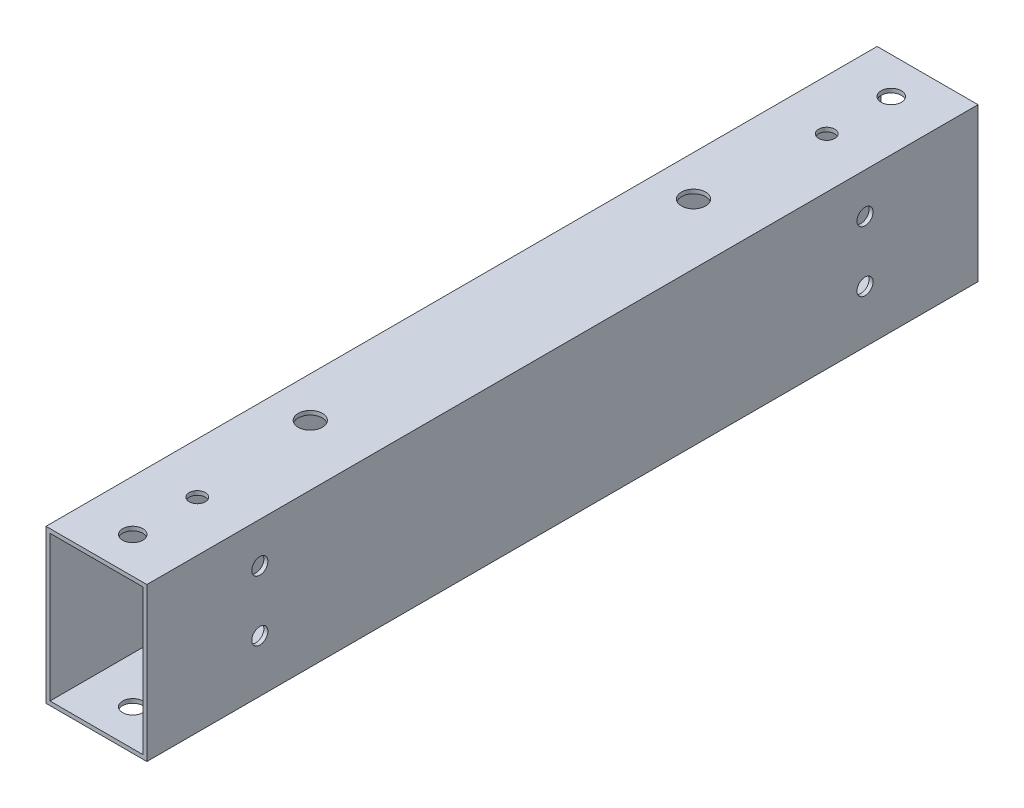
ISO-10303-21;
HEADER;
FILE_DESCRIPTION(('STEP AP214'),'2;1');
FILE_NAME('part.step','',(''),(''),'','','');
FILE_SCHEMA(('AUTOMOTIVE_DESIGN { 1 0 10303 214 1 1 1 1 }'));
ENDSEC;
DATA;
#1=APPLICATION_CONTEXT('core data for automotive mechanical design processes');
#2=APPLICATION_PROTOCOL_DEFINITION('international standard','automotive_design',2000,#1);
#3=PRODUCT_CONTEXT('',#1,'mechanical');
#4=PRODUCT('Part','Part','',(#3));
#5=PRODUCT_RELATED_PRODUCT_CATEGORY('part','',(#4));
#6=PRODUCT_DEFINITION_FORMATION('','',#4);
#7=PRODUCT_DEFINITION_CONTEXT('part definition',#1,'design');
#8=PRODUCT_DEFINITION('design','',#6,#7);
#9=PRODUCT_DEFINITION_SHAPE('','',#8);
#10=(LENGTH_UNIT() NAMED_UNIT(*) SI_UNIT(.MILLI.,.METRE.));
#11=(NAMED_UNIT(*) PLANE_ANGLE_UNIT() SI_UNIT($,.RADIAN.));
#12=(NAMED_UNIT(*) SI_UNIT($,.STERADIAN.) SOLID_ANGLE_UNIT());
#13=UNCERTAINTY_MEASURE_WITH_UNIT(LENGTH_MEASURE(1.E-05),#10,'distance_accuracy_value','');
#14=(GEOMETRIC_REPRESENTATION_CONTEXT(3) GLOBAL_UNCERTAINTY_ASSIGNED_CONTEXT((#13)) GLOBAL_UNIT_ASSIGNED_CONTEXT((#10,
#11,#12)) REPRESENTATION_CONTEXT('',''));
#15=CARTESIAN_POINT('',(0.,0.,0.));
#16=DIRECTION('',(0.,0.,1.));
#17=DIRECTION('',(1.,0.,0.));
#18=AXIS2_PLACEMENT_3D('',#15,#16,#17);
#19=CARTESIAN_POINT('',(-12.5,19.,103.));
#20=DIRECTION('',(0.,-1.,0.));
#21=DIRECTION('',(0.,0.,-1.));
#22=AXIS2_PLACEMENT_3D('',#19,#20,#21);
#23=PLANE('',#22);
#24=CARTESIAN_POINT('',(-2.49999999999999,19.,47.5));
#25=DIRECTION('',(0.,1.,0.));
#26=DIRECTION('',(0.,0.,1.));
#27=AXIS2_PLACEMENT_3D('',#24,#25,#26);
#28=CIRCLE('',#27,3.);
#29=CARTESIAN_POINT('',(-2.49999999999999,19.,50.5));
#30=VERTEX_POINT('',#29);
#31=EDGE_CURVE('E232',#30,#30,#28,.T.);
#32=ORIENTED_EDGE('',*,*,#31,.F.);
#33=EDGE_LOOP('',(#32));
#34=FACE_BOUND('',#33,.T.);
#35=CARTESIAN_POINT('',(-2.5,19.,-47.5));
#36=DIRECTION('',(0.,1.,0.));
#37=DIRECTION('',(0.,0.,1.));
#38=AXIS2_PLACEMENT_3D('',#35,#36,#37);
#39=CIRCLE('',#38,3.);
#40=CARTESIAN_POINT('',(-2.5,19.,-44.5));
#41=VERTEX_POINT('',#40);
#42=EDGE_CURVE('E239',#41,#41,#39,.T.);
#43=ORIENTED_EDGE('',*,*,#42,.F.);
#44=EDGE_LOOP('',(#43));
#45=FACE_BOUND('',#44,.T.);
#46=CARTESIAN_POINT('',(0.,19.,-78.));
#47=DIRECTION('',(0.,1.,0.));
#48=DIRECTION('',(0.,0.,1.));
#49=AXIS2_PLACEMENT_3D('',#46,#47,#48);
#50=CIRCLE('',#49,2.00000000000001);
#51=CARTESIAN_POINT('',(0.,19.,-76.));
#52=VERTEX_POINT('',#51);
#53=EDGE_CURVE('E177',#52,#52,#50,.T.);
#54=ORIENTED_EDGE('',*,*,#53,.F.);
#55=EDGE_LOOP('',(#54));
#56=FACE_BOUND('',#55,.T.);
#57=CARTESIAN_POINT('',(0.,19.,-94.));
#58=DIRECTION('',(0.,1.,0.));
#59=DIRECTION('',(0.,0.,1.));
#60=AXIS2_PLACEMENT_3D('',#57,#58,#59);
#61=CIRCLE('',#60,2.5);
#62=CARTESIAN_POINT('',(0.,19.,-91.5));
#63=VERTEX_POINT('',#62);
#64=EDGE_CURVE('E172',#63,#63,#61,.T.);
#65=ORIENTED_EDGE('',*,*,#64,.F.);
#66=EDGE_LOOP('',(#65));
#67=FACE_BOUND('',#66,.T.);
#68=DIRECTION('',(-1.,0.,0.));
#69=VECTOR('',#68,1.);
#70=CARTESIAN_POINT('',(-12.5,19.,-103.));
#71=LINE('',#70,#69);
#72=CARTESIAN_POINT('',(12.5,19.,-103.));
#73=VERTEX_POINT('',#72);
#74=CARTESIAN_POINT('',(-12.5,19.,-103.));
#75=VERTEX_POINT('',#74);
#76=EDGE_CURVE('E156',#73,#75,#71,.T.);
#77=ORIENTED_EDGE('',*,*,#76,.T.);
#78=DIRECTION('',(0.,0.,-1.));
#79=VECTOR('',#78,1.);
#80=CARTESIAN_POINT('',(-12.5,19.,103.));
#81=LINE('',#80,#79);
#82=CARTESIAN_POINT('',(-12.5,19.,103.));
#83=VERTEX_POINT('',#82);
#84=EDGE_CURVE('E45',#83,#75,#81,.T.);
#85=ORIENTED_EDGE('',*,*,#84,.F.);
#86=DIRECTION('',(-1.,0.,0.));
#87=VECTOR('',#86,1.);
#88=CARTESIAN_POINT('',(-12.5,19.,103.));
#89=LINE('',#88,#87);
#90=CARTESIAN_POINT('',(12.5,19.,103.));
#91=VERTEX_POINT('',#90);
#92=EDGE_CURVE('E146',#91,#83,#89,.T.);
#93=ORIENTED_EDGE('',*,*,#92,.F.);
#94=DIRECTION('',(0.,0.,-1.));
#95=VECTOR('',#94,1.);
#96=CARTESIAN_POINT('',(12.5,19.,103.));
#97=LINE('',#96,#95);
#98=EDGE_CURVE('E11',#91,#73,#97,.T.);
#99=ORIENTED_EDGE('',*,*,#98,.T.);
#100=EDGE_LOOP('',(#77,#85,#93,#99));
#101=FACE_BOUND('',#100,.T.);
#102=CARTESIAN_POINT('',(0.,19.,94.));
#103=DIRECTION('',(0.,-1.,0.));
#104=DIRECTION('',(0.,0.,-1.));
#105=AXIS2_PLACEMENT_3D('',#102,#103,#104);
#106=CIRCLE('',#105,2.5);
#107=CARTESIAN_POINT('',(0.,19.,91.5));
#108=VERTEX_POINT('',#107);
#109=EDGE_CURVE('E182',#108,#108,#106,.T.);
#110=ORIENTED_EDGE('',*,*,#109,.T.);
#111=EDGE_LOOP('',(#110));
#112=FACE_BOUND('',#111,.T.);
#113=CARTESIAN_POINT('',(0.,19.,78.));
#114=DIRECTION('',(0.,-1.,0.));
#115=DIRECTION('',(0.,0.,-1.));
#116=AXIS2_PLACEMENT_3D('',#113,#114,#115);
#117=CIRCLE('',#116,2.00000000000001);
#118=CARTESIAN_POINT('',(0.,19.,76.));
#119=VERTEX_POINT('',#118);
#120=EDGE_CURVE('E187',#119,#119,#117,.T.);
#121=ORIENTED_EDGE('',*,*,#120,.T.);
#122=EDGE_LOOP('',(#121));
#123=FACE_BOUND('',#122,.T.);
#124=ADVANCED_FACE('F36',(#34,#45,#56,#67,#101,#112,#123),#23,.F.);
#125=CARTESIAN_POINT('',(-12.5,-19.,103.));
#126=DIRECTION('',(0.,1.,0.));
#127=DIRECTION('',(0.,0.,1.));
#128=AXIS2_PLACEMENT_3D('',#125,#126,#127);
#129=PLANE('',#128);
#130=CARTESIAN_POINT('',(-2.49999999999999,-19.,47.5));
#131=DIRECTION('',(0.,1.,0.));
#132=DIRECTION('',(0.,0.,1.));
#133=AXIS2_PLACEMENT_3D('',#130,#131,#132);
#134=CIRCLE('',#133,3.);
#135=CARTESIAN_POINT('',(-2.49999999999999,-19.,50.5));
#136=VERTEX_POINT('',#135);
#137=EDGE_CURVE('E197',#136,#136,#134,.F.);
#138=ORIENTED_EDGE('',*,*,#137,.F.);
#139=EDGE_LOOP('',(#138));
#140=FACE_BOUND('',#139,.T.);
#141=CARTESIAN_POINT('',(-2.5,-19.,-47.5));
#142=DIRECTION('',(0.,1.,0.));
#143=DIRECTION('',(0.,0.,1.));
#144=AXIS2_PLACEMENT_3D('',#141,#142,#143);
#145=CIRCLE('',#144,3.);
#146=CARTESIAN_POINT('',(-2.5,-19.,-44.5));
#147=VERTEX_POINT('',#146);
#148=EDGE_CURVE('E192',#147,#147,#145,.F.);
#149=ORIENTED_EDGE('',*,*,#148,.F.);
#150=EDGE_LOOP('',(#149));
#151=FACE_BOUND('',#150,.T.);
#152=CARTESIAN_POINT('',(0.,-19.,-78.));
#153=DIRECTION('',(0.,1.,0.));
#154=DIRECTION('',(0.,0.,1.));
#155=AXIS2_PLACEMENT_3D('',#152,#153,#154);
#156=CIRCLE('',#155,2.00000000000001);
#157=CARTESIAN_POINT('',(0.,-19.,-76.));
#158=VERTEX_POINT('',#157);
#159=EDGE_CURVE('E264',#158,#158,#156,.T.);
#160=ORIENTED_EDGE('',*,*,#159,.T.);
#161=EDGE_LOOP('',(#160));
#162=FACE_BOUND('',#161,.T.);
#163=CARTESIAN_POINT('',(0.,-19.,-94.));
#164=DIRECTION('',(0.,1.,0.));
#165=DIRECTION('',(0.,0.,1.));
#166=AXIS2_PLACEMENT_3D('',#163,#164,#165);
#167=CIRCLE('',#166,2.5);
#168=CARTESIAN_POINT('',(0.,-19.,-91.5));
#169=VERTEX_POINT('',#168);
#170=EDGE_CURVE('E133',#169,#169,#167,.T.);
#171=ORIENTED_EDGE('',*,*,#170,.T.);
#172=EDGE_LOOP('',(#171));
#173=FACE_BOUND('',#172,.T.);
#174=DIRECTION('',(1.,0.,0.));
#175=VECTOR('',#174,1.);
#176=CARTESIAN_POINT('',(-12.5,-19.,-103.));
#177=LINE('',#176,#175);
#178=CARTESIAN_POINT('',(-12.5,-19.,-103.));
#179=VERTEX_POINT('',#178);
#180=CARTESIAN_POINT('',(12.5,-19.,-103.));
#181=VERTEX_POINT('',#180);
#182=EDGE_CURVE('E147',#179,#181,#177,.T.);
#183=ORIENTED_EDGE('',*,*,#182,.T.);
#184=DIRECTION('',(0.,0.,-1.));
#185=VECTOR('',#184,1.);
#186=CARTESIAN_POINT('',(12.5,-19.,103.));
#187=LINE('',#186,#185);
#188=CARTESIAN_POINT('',(12.5,-19.,103.));
#189=VERTEX_POINT('',#188);
#190=EDGE_CURVE('E153',#189,#181,#187,.T.);
#191=ORIENTED_EDGE('',*,*,#190,.F.);
#192=DIRECTION('',(1.,0.,0.));
#193=VECTOR('',#192,1.);
#194=CARTESIAN_POINT('',(-12.5,-19.,103.));
#195=LINE('',#194,#193);
#196=CARTESIAN_POINT('',(-12.5,-19.,103.));
#197=VERTEX_POINT('',#196);
#198=EDGE_CURVE('E151',#197,#189,#195,.T.);
#199=ORIENTED_EDGE('',*,*,#198,.F.);
#200=DIRECTION('',(0.,0.,-1.));
#201=VECTOR('',#200,1.);
#202=CARTESIAN_POINT('',(-12.5,-19.,103.));
#203=LINE('',#202,#201);
#204=EDGE_CURVE('E163',#197,#179,#203,.T.);
#205=ORIENTED_EDGE('',*,*,#204,.T.);
#206=EDGE_LOOP('',(#183,#191,#199,#205));
#207=FACE_BOUND('',#206,.T.);
#208=CARTESIAN_POINT('',(0.,-19.,94.));
#209=DIRECTION('',(0.,1.,0.));
#210=DIRECTION('',(0.,0.,1.));
#211=AXIS2_PLACEMENT_3D('',#208,#209,#210);
#212=CIRCLE('',#211,2.5);
#213=CARTESIAN_POINT('',(0.,-19.,96.5));
#214=VERTEX_POINT('',#213);
#215=EDGE_CURVE('E257',#214,#214,#212,.F.);
#216=ORIENTED_EDGE('',*,*,#215,.F.);
#217=EDGE_LOOP('',(#216));
#218=FACE_BOUND('',#217,.T.);
#219=CARTESIAN_POINT('',(0.,-19.,78.));
#220=DIRECTION('',(0.,1.,0.));
#221=DIRECTION('',(0.,0.,1.));
#222=AXIS2_PLACEMENT_3D('',#219,#220,#221);
#223=CIRCLE('',#222,2.00000000000001);
#224=CARTESIAN_POINT('',(0.,-19.,80.));
#225=VERTEX_POINT('',#224);
#226=EDGE_CURVE('E250',#225,#225,#223,.F.);
#227=ORIENTED_EDGE('',*,*,#226,.F.);
#228=EDGE_LOOP('',(#227));
#229=FACE_BOUND('',#228,.T.);
#230=ADVANCED_FACE('F273',(#140,#151,#162,#173,#207,#218,#229),#129,.F.);
#231=CARTESIAN_POINT('',(-11.5,18.,103.));
#232=DIRECTION('',(0.,-1.,0.));
#233=DIRECTION('',(0.,0.,-1.));
#234=AXIS2_PLACEMENT_3D('',#231,#232,#233);
#235=PLANE('',#234);
#236=CARTESIAN_POINT('',(-2.49999999999999,18.,47.5));
#237=DIRECTION('',(0.,-1.,0.));
#238=DIRECTION('',(0.,0.,-1.));
#239=AXIS2_PLACEMENT_3D('',#236,#237,#238);
#240=CIRCLE('',#239,3.);
#241=CARTESIAN_POINT('',(-2.49999999999999,18.,44.5));
#242=VERTEX_POINT('',#241);
#243=EDGE_CURVE('E196',#242,#242,#240,.T.);
#244=ORIENTED_EDGE('',*,*,#243,.F.);
#245=EDGE_LOOP('',(#244));
#246=FACE_BOUND('',#245,.T.);
#247=CARTESIAN_POINT('',(-2.5,18.,-47.5));
#248=DIRECTION('',(0.,-1.,0.));
#249=DIRECTION('',(0.,0.,-1.));
#250=AXIS2_PLACEMENT_3D('',#247,#248,#249);
#251=CIRCLE('',#250,3.);
#252=CARTESIAN_POINT('',(-2.5,18.,-50.5));
#253=VERTEX_POINT('',#252);
#254=EDGE_CURVE('E191',#253,#253,#251,.T.);
#255=ORIENTED_EDGE('',*,*,#254,.F.);
#256=EDGE_LOOP('',(#255));
#257=FACE_BOUND('',#256,.T.);
#258=CARTESIAN_POINT('',(0.,18.,94.));
#259=DIRECTION('',(0.,-1.,0.));
#260=DIRECTION('',(0.,0.,-1.));
#261=AXIS2_PLACEMENT_3D('',#258,#259,#260);
#262=CIRCLE('',#261,2.5);
#263=CARTESIAN_POINT('',(0.,18.,91.5));
#264=VERTEX_POINT('',#263);
#265=EDGE_CURVE('E181',#264,#264,#262,.F.);
#266=ORIENTED_EDGE('',*,*,#265,.T.);
#267=EDGE_LOOP('',(#266));
#268=FACE_BOUND('',#267,.T.);
#269=CARTESIAN_POINT('',(0.,18.,-78.));
#270=DIRECTION('',(0.,-1.,0.));
#271=DIRECTION('',(0.,0.,-1.));
#272=AXIS2_PLACEMENT_3D('',#269,#270,#271);
#273=CIRCLE('',#272,2.00000000000001);
#274=CARTESIAN_POINT('',(0.,18.,-80.));
#275=VERTEX_POINT('',#274);
#276=EDGE_CURVE('E176',#275,#275,#273,.T.);
#277=ORIENTED_EDGE('',*,*,#276,.F.);
#278=EDGE_LOOP('',(#277));
#279=FACE_BOUND('',#278,.T.);
#280=CARTESIAN_POINT('',(0.,18.,-94.));
#281=DIRECTION('',(0.,-1.,0.));
#282=DIRECTION('',(0.,0.,-1.));
#283=AXIS2_PLACEMENT_3D('',#280,#281,#282);
#284=CIRCLE('',#283,2.5);
#285=CARTESIAN_POINT('',(0.,18.,-96.5));
#286=VERTEX_POINT('',#285);
#287=EDGE_CURVE('E171',#286,#286,#284,.T.);
#288=ORIENTED_EDGE('',*,*,#287,.F.);
#289=EDGE_LOOP('',(#288));
#290=FACE_BOUND('',#289,.T.);
#291=DIRECTION('',(-1.,0.,0.));
#292=VECTOR('',#291,1.);
#293=CARTESIAN_POINT('',(-11.5,18.,-103.));
#294=LINE('',#293,#292);
#295=CARTESIAN_POINT('',(11.5,18.,-103.));
#296=VERTEX_POINT('',#295);
#297=CARTESIAN_POINT('',(-11.5,18.,-103.));
#298=VERTEX_POINT('',#297);
#299=EDGE_CURVE('E119',#296,#298,#294,.T.);
#300=ORIENTED_EDGE('',*,*,#299,.F.);
#301=DIRECTION('',(0.,0.,-1.));
#302=VECTOR('',#301,1.);
#303=CARTESIAN_POINT('',(11.5,18.,103.));
#304=LINE('',#303,#302);
#305=CARTESIAN_POINT('',(11.5,18.,103.));
#306=VERTEX_POINT('',#305);
#307=EDGE_CURVE('E106',#306,#296,#304,.T.);
#308=ORIENTED_EDGE('',*,*,#307,.F.);
#309=DIRECTION('',(-1.,0.,0.));
#310=VECTOR('',#309,1.);
#311=CARTESIAN_POINT('',(-11.5,18.,103.));
#312=LINE('',#311,#310);
#313=CARTESIAN_POINT('',(-11.5,18.,103.));
#314=VERTEX_POINT('',#313);
#315=EDGE_CURVE('E111',#306,#314,#312,.T.);
#316=ORIENTED_EDGE('',*,*,#315,.T.);
#317=DIRECTION('',(0.,0.,-1.));
#318=VECTOR('',#317,1.);
#319=CARTESIAN_POINT('',(-11.5,18.,103.));
#320=LINE('',#319,#318);
#321=EDGE_CURVE('E121',#314,#298,#320,.T.);
#322=ORIENTED_EDGE('',*,*,#321,.T.);
#323=EDGE_LOOP('',(#300,#308,#316,#322));
#324=FACE_BOUND('',#323,.T.);
#325=CARTESIAN_POINT('',(0.,18.,78.));
#326=DIRECTION('',(0.,-1.,0.));
#327=DIRECTION('',(0.,0.,-1.));
#328=AXIS2_PLACEMENT_3D('',#325,#326,#327);
#329=CIRCLE('',#328,2.00000000000001);
#330=CARTESIAN_POINT('',(0.,18.,76.));
#331=VERTEX_POINT('',#330);
#332=EDGE_CURVE('E186',#331,#331,#329,.F.);
#333=ORIENTED_EDGE('',*,*,#332,.T.);
#334=EDGE_LOOP('',(#333));
#335=FACE_BOUND('',#334,.T.);
#336=ADVANCED_FACE('F115',(#246,#257,#268,#279,#290,#324,#335),#235,.T.);
#337=CARTESIAN_POINT('',(-11.5,-18.,103.));
#338=DIRECTION('',(0.,1.,0.));
#339=DIRECTION('',(0.,0.,1.));
#340=AXIS2_PLACEMENT_3D('',#337,#338,#339);
#341=PLANE('',#340);
#342=CARTESIAN_POINT('',(-2.49999999999999,-18.,47.5));
#343=DIRECTION('',(0.,1.,0.));
#344=DIRECTION('',(0.,0.,1.));
#345=AXIS2_PLACEMENT_3D('',#342,#343,#344);
#346=CIRCLE('',#345,3.);
#347=CARTESIAN_POINT('',(-2.49999999999999,-18.,50.5));
#348=VERTEX_POINT('',#347);
#349=EDGE_CURVE('E193',#348,#348,#346,.T.);
#350=ORIENTED_EDGE('',*,*,#349,.F.);
#351=EDGE_LOOP('',(#350));
#352=FACE_BOUND('',#351,.T.);
#353=CARTESIAN_POINT('',(-2.5,-18.,-47.5));
#354=DIRECTION('',(0.,1.,0.));
#355=DIRECTION('',(0.,0.,1.));
#356=AXIS2_PLACEMENT_3D('',#353,#354,#355);
#357=CIRCLE('',#356,3.);
#358=CARTESIAN_POINT('',(-2.5,-18.,-44.5));
#359=VERTEX_POINT('',#358);
#360=EDGE_CURVE('E188',#359,#359,#357,.T.);
#361=ORIENTED_EDGE('',*,*,#360,.F.);
#362=EDGE_LOOP('',(#361));
#363=FACE_BOUND('',#362,.T.);
#364=CARTESIAN_POINT('',(0.,-18.,94.));
#365=DIRECTION('',(0.,1.,0.));
#366=DIRECTION('',(0.,0.,1.));
#367=AXIS2_PLACEMENT_3D('',#364,#365,#366);
#368=CIRCLE('',#367,2.5);
#369=CARTESIAN_POINT('',(0.,-18.,96.5));
#370=VERTEX_POINT('',#369);
#371=EDGE_CURVE('E178',#370,#370,#368,.F.);
#372=ORIENTED_EDGE('',*,*,#371,.T.);
#373=EDGE_LOOP('',(#372));
#374=FACE_BOUND('',#373,.T.);
#375=CARTESIAN_POINT('',(0.,-18.,-78.));
#376=DIRECTION('',(0.,1.,0.));
#377=DIRECTION('',(0.,0.,1.));
#378=AXIS2_PLACEMENT_3D('',#375,#376,#377);
#379=CIRCLE('',#378,2.00000000000001);
#380=CARTESIAN_POINT('',(0.,-18.,-76.));
#381=VERTEX_POINT('',#380);
#382=EDGE_CURVE('E173',#381,#381,#379,.T.);
#383=ORIENTED_EDGE('',*,*,#382,.F.);
#384=EDGE_LOOP('',(#383));
#385=FACE_BOUND('',#384,.T.);
#386=CARTESIAN_POINT('',(0.,-18.,-94.));
#387=DIRECTION('',(0.,1.,0.));
#388=DIRECTION('',(0.,0.,1.));
#389=AXIS2_PLACEMENT_3D('',#386,#387,#388);
#390=CIRCLE('',#389,2.5);
#391=CARTESIAN_POINT('',(0.,-18.,-91.5));
#392=VERTEX_POINT('',#391);
#393=EDGE_CURVE('E168',#392,#392,#390,.T.);
#394=ORIENTED_EDGE('',*,*,#393,.F.);
#395=EDGE_LOOP('',(#394));
#396=FACE_BOUND('',#395,.T.);
#397=DIRECTION('',(1.,0.,0.));
#398=VECTOR('',#397,1.);
#399=CARTESIAN_POINT('',(-11.5,-18.,-103.));
#400=LINE('',#399,#398);
#401=CARTESIAN_POINT('',(-11.5,-18.,-103.));
#402=VERTEX_POINT('',#401);
#403=CARTESIAN_POINT('',(11.5,-18.,-103.));
#404=VERTEX_POINT('',#403);
#405=EDGE_CURVE('E112',#402,#404,#400,.T.);
#406=ORIENTED_EDGE('',*,*,#405,.F.);
#407=DIRECTION('',(0.,0.,-1.));
#408=VECTOR('',#407,1.);
#409=CARTESIAN_POINT('',(-11.5,-18.,103.));
#410=LINE('',#409,#408);
#411=CARTESIAN_POINT('',(-11.5,-18.,103.));
#412=VERTEX_POINT('',#411);
#413=EDGE_CURVE('E53',#412,#402,#410,.T.);
#414=ORIENTED_EDGE('',*,*,#413,.F.);
#415=DIRECTION('',(1.,0.,0.));
#416=VECTOR('',#415,1.);
#417=CARTESIAN_POINT('',(-11.5,-18.,103.));
#418=LINE('',#417,#416);
#419=CARTESIAN_POINT('',(11.5,-18.,103.));
#420=VERTEX_POINT('',#419);
#421=EDGE_CURVE('E127',#412,#420,#418,.T.);
#422=ORIENTED_EDGE('',*,*,#421,.T.);
#423=DIRECTION('',(0.,0.,-1.));
#424=VECTOR('',#423,1.);
#425=CARTESIAN_POINT('',(11.5,-18.,103.));
#426=LINE('',#425,#424);
#427=EDGE_CURVE('E107',#420,#404,#426,.T.);
#428=ORIENTED_EDGE('',*,*,#427,.T.);
#429=EDGE_LOOP('',(#406,#414,#422,#428));
#430=FACE_BOUND('',#429,.T.);
#431=CARTESIAN_POINT('',(0.,-18.,78.));
#432=DIRECTION('',(0.,1.,0.));
#433=DIRECTION('',(0.,0.,1.));
#434=AXIS2_PLACEMENT_3D('',#431,#432,#433);
#435=CIRCLE('',#434,2.00000000000001);
#436=CARTESIAN_POINT('',(0.,-18.,80.));
#437=VERTEX_POINT('',#436);
#438=EDGE_CURVE('E183',#437,#437,#435,.F.);
#439=ORIENTED_EDGE('',*,*,#438,.T.);
#440=EDGE_LOOP('',(#439));
#441=FACE_BOUND('',#440,.T.);
#442=ADVANCED_FACE('F312',(#352,#363,#374,#385,#396,#430,#441),#341,.T.);
#443=CARTESIAN_POINT('',(0.,0.,103.));
#444=DIRECTION('',(0.,0.,1.));
#445=DIRECTION('',(1.,0.,0.));
#446=AXIS2_PLACEMENT_3D('',#443,#444,#445);
#447=PLANE('',#446);
#448=DIRECTION('',(0.,1.,0.));
#449=VECTOR('',#448,1.);
#450=CARTESIAN_POINT('',(12.5,19.,103.));
#451=LINE('',#450,#449);
#452=EDGE_CURVE('E143',#189,#91,#451,.T.);
#453=ORIENTED_EDGE('',*,*,#452,.T.);
#454=ORIENTED_EDGE('',*,*,#92,.T.);
#455=DIRECTION('',(0.,-1.,0.));
#456=VECTOR('',#455,1.);
#457=CARTESIAN_POINT('',(-12.5,19.,103.));
#458=LINE('',#457,#456);
#459=EDGE_CURVE('E149',#83,#197,#458,.T.);
#460=ORIENTED_EDGE('',*,*,#459,.T.);
#461=ORIENTED_EDGE('',*,*,#198,.T.);
#462=EDGE_LOOP('',(#453,#454,#460,#461));
#463=FACE_BOUND('',#462,.T.);
#464=ORIENTED_EDGE('',*,*,#315,.F.);
#465=DIRECTION('',(0.,1.,0.));
#466=VECTOR('',#465,1.);
#467=CARTESIAN_POINT('',(11.5,18.,103.));
#468=LINE('',#467,#466);
#469=EDGE_CURVE('E103',#420,#306,#468,.T.);
#470=ORIENTED_EDGE('',*,*,#469,.F.);
#471=ORIENTED_EDGE('',*,*,#421,.F.);
#472=DIRECTION('',(0.,-1.,0.));
#473=VECTOR('',#472,1.);
#474=CARTESIAN_POINT('',(-11.5,18.,103.));
#475=LINE('',#474,#473);
#476=EDGE_CURVE('E125',#314,#412,#475,.T.);
#477=ORIENTED_EDGE('',*,*,#476,.F.);
#478=EDGE_LOOP('',(#464,#470,#471,#477));
#479=FACE_BOUND('',#478,.T.);
#480=ADVANCED_FACE('F124',(#463,#479),#447,.T.);
#481=CARTESIAN_POINT('',(0.,0.,-103.));
#482=DIRECTION('',(0.,0.,1.));
#483=DIRECTION('',(1.,0.,0.));
#484=AXIS2_PLACEMENT_3D('',#481,#482,#483);
#485=PLANE('',#484);
#486=DIRECTION('',(0.,1.,0.));
#487=VECTOR('',#486,1.);
#488=CARTESIAN_POINT('',(12.5,19.,-103.));
#489=LINE('',#488,#487);
#490=EDGE_CURVE('E120',#181,#73,#489,.T.);
#491=ORIENTED_EDGE('',*,*,#490,.F.);
#492=ORIENTED_EDGE('',*,*,#182,.F.);
#493=DIRECTION('',(0.,-1.,0.));
#494=VECTOR('',#493,1.);
#495=CARTESIAN_POINT('',(-12.5,19.,-103.));
#496=LINE('',#495,#494);
#497=EDGE_CURVE('E158',#75,#179,#496,.T.);
#498=ORIENTED_EDGE('',*,*,#497,.F.);
#499=ORIENTED_EDGE('',*,*,#76,.F.);
#500=EDGE_LOOP('',(#491,#492,#498,#499));
#501=FACE_BOUND('',#500,.T.);
#502=DIRECTION('',(0.,1.,0.));
#503=VECTOR('',#502,1.);
#504=CARTESIAN_POINT('',(11.5,18.,-103.));
#505=LINE('',#504,#503);
#506=EDGE_CURVE('E61',#404,#296,#505,.T.);
#507=ORIENTED_EDGE('',*,*,#506,.T.);
#508=ORIENTED_EDGE('',*,*,#299,.T.);
#509=DIRECTION('',(0.,-1.,0.));
#510=VECTOR('',#509,1.);
#511=CARTESIAN_POINT('',(-11.5,18.,-103.));
#512=LINE('',#511,#510);
#513=EDGE_CURVE('E135',#298,#402,#512,.T.);
#514=ORIENTED_EDGE('',*,*,#513,.T.);
#515=ORIENTED_EDGE('',*,*,#405,.T.);
#516=EDGE_LOOP('',(#507,#508,#514,#515));
#517=FACE_BOUND('',#516,.T.);
#518=ADVANCED_FACE('F306',(#501,#517),#485,.F.);
#519=CARTESIAN_POINT('',(12.5,19.,103.));
#520=DIRECTION('',(-1.,0.,0.));
#521=DIRECTION('',(0.,-1.,0.));
#522=AXIS2_PLACEMENT_3D('',#519,#520,#521);
#523=PLANE('',#522);
#524=CARTESIAN_POINT('',(12.5,-6.,75.));
#525=DIRECTION('',(1.,0.,0.));
#526=DIRECTION('',(0.,1.,0.));
#527=AXIS2_PLACEMENT_3D('',#524,#525,#526);
#528=CIRCLE('',#527,2.);
#529=CARTESIAN_POINT('',(12.5,-4.00000000000001,75.));
#530=VERTEX_POINT('',#529);
#531=EDGE_CURVE('E402',#530,#530,#528,.T.);
#532=ORIENTED_EDGE('',*,*,#531,.F.);
#533=EDGE_LOOP('',(#532));
#534=FACE_BOUND('',#533,.T.);
#535=CARTESIAN_POINT('',(12.5,-5.99999999999998,-75.));
#536=DIRECTION('',(1.,0.,0.));
#537=DIRECTION('',(0.,-1.,0.));
#538=AXIS2_PLACEMENT_3D('',#535,#536,#537);
#539=CIRCLE('',#538,2.);
#540=CARTESIAN_POINT('',(12.5,-7.99999999999998,-75.));
#541=VERTEX_POINT('',#540);
#542=EDGE_CURVE('E406',#541,#541,#539,.T.);
#543=ORIENTED_EDGE('',*,*,#542,.F.);
#544=EDGE_LOOP('',(#543));
#545=FACE_BOUND('',#544,.T.);
#546=CARTESIAN_POINT('',(12.5,9.00000000000002,-75.));
#547=DIRECTION('',(1.,0.,0.));
#548=DIRECTION('',(0.,-1.,0.));
#549=AXIS2_PLACEMENT_3D('',#546,#547,#548);
#550=CIRCLE('',#549,2.);
#551=CARTESIAN_POINT('',(12.5,7.00000000000002,-75.));
#552=VERTEX_POINT('',#551);
#553=EDGE_CURVE('E219',#552,#552,#550,.T.);
#554=ORIENTED_EDGE('',*,*,#553,.F.);
#555=EDGE_LOOP('',(#554));
#556=FACE_BOUND('',#555,.T.);
#557=CARTESIAN_POINT('',(12.5,9.,75.));
#558=DIRECTION('',(1.,0.,0.));
#559=DIRECTION('',(0.,1.,0.));
#560=AXIS2_PLACEMENT_3D('',#557,#558,#559);
#561=CIRCLE('',#560,2.);
#562=CARTESIAN_POINT('',(12.5,11.,75.));
#563=VERTEX_POINT('',#562);
#564=EDGE_CURVE('E225',#563,#563,#561,.T.);
#565=ORIENTED_EDGE('',*,*,#564,.F.);
#566=EDGE_LOOP('',(#565));
#567=FACE_BOUND('',#566,.T.);
#568=ORIENTED_EDGE('',*,*,#490,.T.);
#569=ORIENTED_EDGE('',*,*,#98,.F.);
#570=ORIENTED_EDGE('',*,*,#452,.F.);
#571=ORIENTED_EDGE('',*,*,#190,.T.);
#572=EDGE_LOOP('',(#568,#569,#570,#571));
#573=FACE_BOUND('',#572,.T.);
#574=ADVANCED_FACE('F38',(#534,#545,#556,#567,#573),#523,.F.);
#575=CARTESIAN_POINT('',(-12.5,19.,103.));
#576=DIRECTION('',(1.,0.,0.));
#577=DIRECTION('',(0.,1.,0.));
#578=AXIS2_PLACEMENT_3D('',#575,#576,#577);
#579=PLANE('',#578);
#580=CARTESIAN_POINT('',(-12.5,-6.00000000000001,75.));
#581=DIRECTION('',(1.,0.,0.));
#582=DIRECTION('',(0.,1.,0.));
#583=AXIS2_PLACEMENT_3D('',#580,#581,#582);
#584=CIRCLE('',#583,2.);
#585=CARTESIAN_POINT('',(-12.5,-4.00000000000001,75.));
#586=VERTEX_POINT('',#585);
#587=EDGE_CURVE('E206',#586,#586,#584,.T.);
#588=ORIENTED_EDGE('',*,*,#587,.T.);
#589=EDGE_LOOP('',(#588));
#590=FACE_BOUND('',#589,.T.);
#591=CARTESIAN_POINT('',(-12.5,-5.99999999999999,-75.));
#592=DIRECTION('',(1.,0.,0.));
#593=DIRECTION('',(0.,-1.,0.));
#594=AXIS2_PLACEMENT_3D('',#591,#592,#593);
#595=CIRCLE('',#594,2.);
#596=CARTESIAN_POINT('',(-12.5,-7.99999999999998,-75.));
#597=VERTEX_POINT('',#596);
#598=EDGE_CURVE('E552',#597,#597,#595,.T.);
#599=ORIENTED_EDGE('',*,*,#598,.T.);
#600=EDGE_LOOP('',(#599));
#601=FACE_BOUND('',#600,.T.);
#602=CARTESIAN_POINT('',(-12.5,9.00000000000001,-75.));
#603=DIRECTION('',(1.,0.,0.));
#604=DIRECTION('',(0.,-1.,0.));
#605=AXIS2_PLACEMENT_3D('',#602,#603,#604);
#606=CIRCLE('',#605,2.);
#607=CARTESIAN_POINT('',(-12.5,7.00000000000002,-75.));
#608=VERTEX_POINT('',#607);
#609=EDGE_CURVE('E559',#608,#608,#606,.T.);
#610=ORIENTED_EDGE('',*,*,#609,.T.);
#611=EDGE_LOOP('',(#610));
#612=FACE_BOUND('',#611,.T.);
#613=CARTESIAN_POINT('',(-12.5,9.,75.));
#614=DIRECTION('',(1.,0.,0.));
#615=DIRECTION('',(0.,1.,0.));
#616=AXIS2_PLACEMENT_3D('',#613,#614,#615);
#617=CIRCLE('',#616,2.);
#618=CARTESIAN_POINT('',(-12.5,11.,75.));
#619=VERTEX_POINT('',#618);
#620=EDGE_CURVE('E202',#619,#619,#617,.T.);
#621=ORIENTED_EDGE('',*,*,#620,.T.);
#622=EDGE_LOOP('',(#621));
#623=FACE_BOUND('',#622,.T.);
#624=ORIENTED_EDGE('',*,*,#497,.T.);
#625=ORIENTED_EDGE('',*,*,#204,.F.);
#626=ORIENTED_EDGE('',*,*,#459,.F.);
#627=ORIENTED_EDGE('',*,*,#84,.T.);
#628=EDGE_LOOP('',(#624,#625,#626,#627));
#629=FACE_BOUND('',#628,.T.);
#630=ADVANCED_FACE('F302',(#590,#601,#612,#623,#629),#579,.F.);
#631=CARTESIAN_POINT('',(11.5,18.,103.));
#632=DIRECTION('',(-1.,0.,0.));
#633=DIRECTION('',(0.,-1.,0.));
#634=AXIS2_PLACEMENT_3D('',#631,#632,#633);
#635=PLANE('',#634);
#636=CARTESIAN_POINT('',(11.5,-6.,75.));
#637=DIRECTION('',(-1.,0.,0.));
#638=DIRECTION('',(0.,-1.,0.));
#639=AXIS2_PLACEMENT_3D('',#636,#637,#638);
#640=CIRCLE('',#639,2.);
#641=CARTESIAN_POINT('',(11.5,-8.,75.));
#642=VERTEX_POINT('',#641);
#643=EDGE_CURVE('E222',#642,#642,#640,.T.);
#644=ORIENTED_EDGE('',*,*,#643,.F.);
#645=EDGE_LOOP('',(#644));
#646=FACE_BOUND('',#645,.T.);
#647=CARTESIAN_POINT('',(11.5,-5.99999999999998,-75.));
#648=DIRECTION('',(-1.,0.,0.));
#649=DIRECTION('',(0.,-1.,0.));
#650=AXIS2_PLACEMENT_3D('',#647,#648,#649);
#651=CIRCLE('',#650,2.);
#652=CARTESIAN_POINT('',(11.5,-7.99999999999998,-75.));
#653=VERTEX_POINT('',#652);
#654=EDGE_CURVE('E209',#653,#653,#651,.T.);
#655=ORIENTED_EDGE('',*,*,#654,.F.);
#656=EDGE_LOOP('',(#655));
#657=FACE_BOUND('',#656,.T.);
#658=CARTESIAN_POINT('',(11.5,9.00000000000002,-75.));
#659=DIRECTION('',(-1.,0.,0.));
#660=DIRECTION('',(0.,-1.,0.));
#661=AXIS2_PLACEMENT_3D('',#658,#659,#660);
#662=CIRCLE('',#661,2.);
#663=CARTESIAN_POINT('',(11.5,7.00000000000002,-75.));
#664=VERTEX_POINT('',#663);
#665=EDGE_CURVE('E205',#664,#664,#662,.T.);
#666=ORIENTED_EDGE('',*,*,#665,.F.);
#667=EDGE_LOOP('',(#666));
#668=FACE_BOUND('',#667,.T.);
#669=CARTESIAN_POINT('',(11.5,9.,75.));
#670=DIRECTION('',(-1.,0.,0.));
#671=DIRECTION('',(0.,-1.,0.));
#672=AXIS2_PLACEMENT_3D('',#669,#670,#671);
#673=CIRCLE('',#672,2.);
#674=CARTESIAN_POINT('',(11.5,7.,75.));
#675=VERTEX_POINT('',#674);
#676=EDGE_CURVE('E201',#675,#675,#673,.T.);
#677=ORIENTED_EDGE('',*,*,#676,.F.);
#678=EDGE_LOOP('',(#677));
#679=FACE_BOUND('',#678,.T.);
#680=ORIENTED_EDGE('',*,*,#506,.F.);
#681=ORIENTED_EDGE('',*,*,#427,.F.);
#682=ORIENTED_EDGE('',*,*,#469,.T.);
#683=ORIENTED_EDGE('',*,*,#307,.T.);
#684=EDGE_LOOP('',(#680,#681,#682,#683));
#685=FACE_BOUND('',#684,.T.);
#686=ADVANCED_FACE('F105',(#646,#657,#668,#679,#685),#635,.T.);
#687=CARTESIAN_POINT('',(-11.5,18.,103.));
#688=DIRECTION('',(1.,0.,0.));
#689=DIRECTION('',(0.,1.,0.));
#690=AXIS2_PLACEMENT_3D('',#687,#688,#689);
#691=PLANE('',#690);
#692=CARTESIAN_POINT('',(-11.5,-6.00000000000001,75.));
#693=DIRECTION('',(1.,0.,0.));
#694=DIRECTION('',(0.,1.,0.));
#695=AXIS2_PLACEMENT_3D('',#692,#693,#694);
#696=CIRCLE('',#695,2.);
#697=CARTESIAN_POINT('',(-11.5,-4.00000000000001,75.));
#698=VERTEX_POINT('',#697);
#699=EDGE_CURVE('E40',#698,#698,#696,.T.);
#700=ORIENTED_EDGE('',*,*,#699,.F.);
#701=EDGE_LOOP('',(#700));
#702=FACE_BOUND('',#701,.T.);
#703=CARTESIAN_POINT('',(-11.5,-5.99999999999999,-75.));
#704=DIRECTION('',(1.,0.,0.));
#705=DIRECTION('',(0.,1.,0.));
#706=AXIS2_PLACEMENT_3D('',#703,#704,#705);
#707=CIRCLE('',#706,2.);
#708=CARTESIAN_POINT('',(-11.5,-3.99999999999999,-75.));
#709=VERTEX_POINT('',#708);
#710=EDGE_CURVE('E207',#709,#709,#707,.T.);
#711=ORIENTED_EDGE('',*,*,#710,.F.);
#712=EDGE_LOOP('',(#711));
#713=FACE_BOUND('',#712,.T.);
#714=CARTESIAN_POINT('',(-11.5,9.00000000000001,-75.));
#715=DIRECTION('',(1.,0.,0.));
#716=DIRECTION('',(0.,1.,0.));
#717=AXIS2_PLACEMENT_3D('',#714,#715,#716);
#718=CIRCLE('',#717,2.);
#719=CARTESIAN_POINT('',(-11.5,11.,-75.));
#720=VERTEX_POINT('',#719);
#721=EDGE_CURVE('E203',#720,#720,#718,.T.);
#722=ORIENTED_EDGE('',*,*,#721,.F.);
#723=EDGE_LOOP('',(#722));
#724=FACE_BOUND('',#723,.T.);
#725=CARTESIAN_POINT('',(-11.5,9.,75.));
#726=DIRECTION('',(1.,0.,0.));
#727=DIRECTION('',(0.,1.,0.));
#728=AXIS2_PLACEMENT_3D('',#725,#726,#727);
#729=CIRCLE('',#728,2.);
#730=CARTESIAN_POINT('',(-11.5,11.,75.));
#731=VERTEX_POINT('',#730);
#732=EDGE_CURVE('E198',#731,#731,#729,.T.);
#733=ORIENTED_EDGE('',*,*,#732,.F.);
#734=EDGE_LOOP('',(#733));
#735=FACE_BOUND('',#734,.T.);
#736=ORIENTED_EDGE('',*,*,#513,.F.);
#737=ORIENTED_EDGE('',*,*,#321,.F.);
#738=ORIENTED_EDGE('',*,*,#476,.T.);
#739=ORIENTED_EDGE('',*,*,#413,.T.);
#740=EDGE_LOOP('',(#736,#737,#738,#739));
#741=FACE_BOUND('',#740,.T.);
#742=ADVANCED_FACE('F279',(#702,#713,#724,#735,#741),#691,.T.);
#743=CARTESIAN_POINT('',(0.,-21.,-94.));
#744=DIRECTION('',(0.,1.,0.));
#745=DIRECTION('',(0.,0.,1.));
#746=AXIS2_PLACEMENT_3D('',#743,#744,#745);
#747=CYLINDRICAL_SURFACE('',#746,2.5);
#748=ORIENTED_EDGE('',*,*,#393,.T.);
#749=EDGE_LOOP('',(#748));
#750=FACE_BOUND('',#749,.T.);
#751=ORIENTED_EDGE('',*,*,#170,.F.);
#752=EDGE_LOOP('',(#751));
#753=FACE_BOUND('',#752,.T.);
#754=ADVANCED_FACE('F276',(#750,#753),#747,.F.);
#755=ORIENTED_EDGE('',*,*,#287,.T.);
#756=EDGE_LOOP('',(#755));
#757=FACE_BOUND('',#756,.T.);
#758=ORIENTED_EDGE('',*,*,#64,.T.);
#759=EDGE_LOOP('',(#758));
#760=FACE_BOUND('',#759,.T.);
#761=ADVANCED_FACE('F278',(#757,#760),#747,.F.);
#762=CARTESIAN_POINT('',(0.,-21.,-78.));
#763=DIRECTION('',(0.,1.,0.));
#764=DIRECTION('',(0.,0.,1.));
#765=AXIS2_PLACEMENT_3D('',#762,#763,#764);
#766=CYLINDRICAL_SURFACE('',#765,2.00000000000001);
#767=ORIENTED_EDGE('',*,*,#382,.T.);
#768=EDGE_LOOP('',(#767));
#769=FACE_BOUND('',#768,.T.);
#770=ORIENTED_EDGE('',*,*,#159,.F.);
#771=EDGE_LOOP('',(#770));
#772=FACE_BOUND('',#771,.T.);
#773=ADVANCED_FACE('F286',(#769,#772),#766,.F.);
#774=ORIENTED_EDGE('',*,*,#276,.T.);
#775=EDGE_LOOP('',(#774));
#776=FACE_BOUND('',#775,.T.);
#777=ORIENTED_EDGE('',*,*,#53,.T.);
#778=EDGE_LOOP('',(#777));
#779=FACE_BOUND('',#778,.T.);
#780=ADVANCED_FACE('F355',(#776,#779),#766,.F.);
#781=CARTESIAN_POINT('',(0.,-21.,94.));
#782=DIRECTION('',(0.,1.,0.));
#783=DIRECTION('',(0.,0.,1.));
#784=AXIS2_PLACEMENT_3D('',#781,#782,#783);
#785=CYLINDRICAL_SURFACE('',#784,2.5);
#786=ORIENTED_EDGE('',*,*,#371,.F.);
#787=EDGE_LOOP('',(#786));
#788=FACE_BOUND('',#787,.T.);
#789=ORIENTED_EDGE('',*,*,#215,.T.);
#790=EDGE_LOOP('',(#789));
#791=FACE_BOUND('',#790,.T.);
#792=ADVANCED_FACE('F349',(#788,#791),#785,.F.);
#793=ORIENTED_EDGE('',*,*,#265,.F.);
#794=EDGE_LOOP('',(#793));
#795=FACE_BOUND('',#794,.T.);
#796=ORIENTED_EDGE('',*,*,#109,.F.);
#797=EDGE_LOOP('',(#796));
#798=FACE_BOUND('',#797,.T.);
#799=ADVANCED_FACE('F339',(#795,#798),#785,.F.);
#800=CARTESIAN_POINT('',(0.,-21.,78.));
#801=DIRECTION('',(0.,1.,0.));
#802=DIRECTION('',(0.,0.,1.));
#803=AXIS2_PLACEMENT_3D('',#800,#801,#802);
#804=CYLINDRICAL_SURFACE('',#803,2.00000000000001);
#805=ORIENTED_EDGE('',*,*,#438,.F.);
#806=EDGE_LOOP('',(#805));
#807=FACE_BOUND('',#806,.T.);
#808=ORIENTED_EDGE('',*,*,#226,.T.);
#809=EDGE_LOOP('',(#808));
#810=FACE_BOUND('',#809,.T.);
#811=ADVANCED_FACE('F335',(#807,#810),#804,.F.);
#812=ORIENTED_EDGE('',*,*,#332,.F.);
#813=EDGE_LOOP('',(#812));
#814=FACE_BOUND('',#813,.T.);
#815=ORIENTED_EDGE('',*,*,#120,.F.);
#816=EDGE_LOOP('',(#815));
#817=FACE_BOUND('',#816,.T.);
#818=ADVANCED_FACE('F338',(#814,#817),#804,.F.);
#819=CARTESIAN_POINT('',(-2.5,-27.4852813742386,-47.5));
#820=DIRECTION('',(0.,1.,0.));
#821=DIRECTION('',(0.,0.,1.));
#822=AXIS2_PLACEMENT_3D('',#819,#820,#821);
#823=CYLINDRICAL_SURFACE('',#822,3.);
#824=ORIENTED_EDGE('',*,*,#360,.T.);
#825=EDGE_LOOP('',(#824));
#826=FACE_BOUND('',#825,.T.);
#827=ORIENTED_EDGE('',*,*,#148,.T.);
#828=EDGE_LOOP('',(#827));
#829=FACE_BOUND('',#828,.T.);
#830=ADVANCED_FACE('F347',(#826,#829),#823,.F.);
#831=ORIENTED_EDGE('',*,*,#254,.T.);
#832=EDGE_LOOP('',(#831));
#833=FACE_BOUND('',#832,.T.);
#834=ORIENTED_EDGE('',*,*,#42,.T.);
#835=EDGE_LOOP('',(#834));
#836=FACE_BOUND('',#835,.T.);
#837=ADVANCED_FACE('F431',(#833,#836),#823,.F.);
#838=CARTESIAN_POINT('',(-2.49999999999999,-27.4852813742386,47.5));
#839=DIRECTION('',(0.,1.,0.));
#840=DIRECTION('',(0.,0.,1.));
#841=AXIS2_PLACEMENT_3D('',#838,#839,#840);
#842=CYLINDRICAL_SURFACE('',#841,3.);
#843=ORIENTED_EDGE('',*,*,#349,.T.);
#844=EDGE_LOOP('',(#843));
#845=FACE_BOUND('',#844,.T.);
#846=ORIENTED_EDGE('',*,*,#137,.T.);
#847=EDGE_LOOP('',(#846));
#848=FACE_BOUND('',#847,.T.);
#849=ADVANCED_FACE('F429',(#845,#848),#842,.F.);
#850=ORIENTED_EDGE('',*,*,#243,.T.);
#851=EDGE_LOOP('',(#850));
#852=FACE_BOUND('',#851,.T.);
#853=ORIENTED_EDGE('',*,*,#31,.T.);
#854=EDGE_LOOP('',(#853));
#855=FACE_BOUND('',#854,.T.);
#856=ADVANCED_FACE('F426',(#852,#855),#842,.F.);
#857=CARTESIAN_POINT('',(-12.5,9.,75.));
#858=DIRECTION('',(1.,0.,0.));
#859=DIRECTION('',(0.,1.,0.));
#860=AXIS2_PLACEMENT_3D('',#857,#858,#859);
#861=CYLINDRICAL_SURFACE('',#860,2.);
#862=ORIENTED_EDGE('',*,*,#732,.T.);
#863=EDGE_LOOP('',(#862));
#864=FACE_BOUND('',#863,.T.);
#865=ORIENTED_EDGE('',*,*,#620,.F.);
#866=EDGE_LOOP('',(#865));
#867=FACE_BOUND('',#866,.T.);
#868=ADVANCED_FACE('F415',(#864,#867),#861,.F.);
#869=ORIENTED_EDGE('',*,*,#676,.T.);
#870=EDGE_LOOP('',(#869));
#871=FACE_BOUND('',#870,.T.);
#872=ORIENTED_EDGE('',*,*,#564,.T.);
#873=EDGE_LOOP('',(#872));
#874=FACE_BOUND('',#873,.T.);
#875=ADVANCED_FACE('F412',(#871,#874),#861,.F.);
#876=CARTESIAN_POINT('',(-12.5,9.00000000000001,-75.));
#877=DIRECTION('',(1.,0.,0.));
#878=DIRECTION('',(0.,1.,0.));
#879=AXIS2_PLACEMENT_3D('',#876,#877,#878);
#880=CYLINDRICAL_SURFACE('',#879,2.);
#881=ORIENTED_EDGE('',*,*,#721,.T.);
#882=EDGE_LOOP('',(#881));
#883=FACE_BOUND('',#882,.T.);
#884=ORIENTED_EDGE('',*,*,#609,.F.);
#885=EDGE_LOOP('',(#884));
#886=FACE_BOUND('',#885,.T.);
#887=ADVANCED_FACE('F414',(#883,#886),#880,.F.);
#888=CARTESIAN_POINT('',(-12.5,-5.99999999999999,-75.));
#889=DIRECTION('',(1.,0.,0.));
#890=DIRECTION('',(0.,1.,0.));
#891=AXIS2_PLACEMENT_3D('',#888,#889,#890);
#892=CYLINDRICAL_SURFACE('',#891,2.);
#893=ORIENTED_EDGE('',*,*,#710,.T.);
#894=EDGE_LOOP('',(#893));
#895=FACE_BOUND('',#894,.T.);
#896=ORIENTED_EDGE('',*,*,#598,.F.);
#897=EDGE_LOOP('',(#896));
#898=FACE_BOUND('',#897,.T.);
#899=ADVANCED_FACE('F422',(#895,#898),#892,.F.);
#900=CARTESIAN_POINT('',(-12.5,-6.00000000000001,75.));
#901=DIRECTION('',(1.,0.,0.));
#902=DIRECTION('',(0.,1.,0.));
#903=AXIS2_PLACEMENT_3D('',#900,#901,#902);
#904=CYLINDRICAL_SURFACE('',#903,2.);
#905=ORIENTED_EDGE('',*,*,#699,.T.);
#906=EDGE_LOOP('',(#905));
#907=FACE_BOUND('',#906,.T.);
#908=ORIENTED_EDGE('',*,*,#587,.F.);
#909=EDGE_LOOP('',(#908));
#910=FACE_BOUND('',#909,.T.);
#911=ADVANCED_FACE('F513',(#907,#910),#904,.F.);
#912=ORIENTED_EDGE('',*,*,#665,.T.);
#913=EDGE_LOOP('',(#912));
#914=FACE_BOUND('',#913,.T.);
#915=ORIENTED_EDGE('',*,*,#553,.T.);
#916=EDGE_LOOP('',(#915));
#917=FACE_BOUND('',#916,.T.);
#918=ADVANCED_FACE('F425',(#914,#917),#880,.F.);
#919=ORIENTED_EDGE('',*,*,#654,.T.);
#920=EDGE_LOOP('',(#919));
#921=FACE_BOUND('',#920,.T.);
#922=ORIENTED_EDGE('',*,*,#542,.T.);
#923=EDGE_LOOP('',(#922));
#924=FACE_BOUND('',#923,.T.);
#925=ADVANCED_FACE('F514',(#921,#924),#892,.F.);
#926=ORIENTED_EDGE('',*,*,#643,.T.);
#927=EDGE_LOOP('',(#926));
#928=FACE_BOUND('',#927,.T.);
#929=ORIENTED_EDGE('',*,*,#531,.T.);
#930=EDGE_LOOP('',(#929));
#931=FACE_BOUND('',#930,.T.);
#932=ADVANCED_FACE('F524',(#928,#931),#904,.F.);
#933=CLOSED_SHELL('',(#124,#230,#336,#442,#480,#518,#574,#630,#686,#742,#754,#761,#773,#780,
#792,#799,#811,#818,#830,#837,#849,#856,#868,#875,#887,#899,#911,#918,#925,#932));
#934=MANIFOLD_SOLID_BREP('B2',#933);
#935=ADVANCED_BREP_SHAPE_REPRESENTATION('',(#18,#934),#14);
#936=SHAPE_DEFINITION_REPRESENTATION(#9,#935);
ENDSEC;
END-ISO-10303-21;
